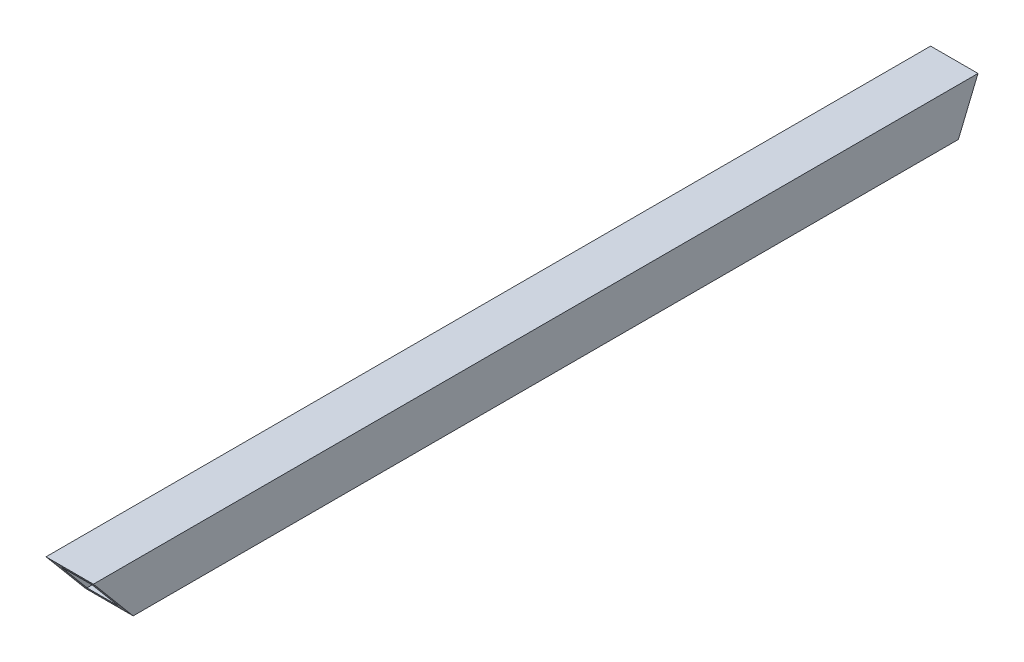
ISO-10303-21;
HEADER;
FILE_DESCRIPTION(('STEP AP214'),'2;1');
FILE_NAME('part.step','',(''),(''),'','','');
FILE_SCHEMA(('AUTOMOTIVE_DESIGN { 1 0 10303 214 1 1 1 1 }'));
ENDSEC;
DATA;
#1=APPLICATION_CONTEXT('core data for automotive mechanical design processes');
#2=APPLICATION_PROTOCOL_DEFINITION('international standard','automotive_design',2000,#1);
#3=PRODUCT_CONTEXT('',#1,'mechanical');
#4=PRODUCT('Part','Part','',(#3));
#5=PRODUCT_RELATED_PRODUCT_CATEGORY('part','',(#4));
#6=PRODUCT_DEFINITION_FORMATION('','',#4);
#7=PRODUCT_DEFINITION_CONTEXT('part definition',#1,'design');
#8=PRODUCT_DEFINITION('design','',#6,#7);
#9=PRODUCT_DEFINITION_SHAPE('','',#8);
#10=(LENGTH_UNIT() NAMED_UNIT(*) SI_UNIT(.MILLI.,.METRE.));
#11=(NAMED_UNIT(*) PLANE_ANGLE_UNIT() SI_UNIT($,.RADIAN.));
#12=(NAMED_UNIT(*) SI_UNIT($,.STERADIAN.) SOLID_ANGLE_UNIT());
#13=UNCERTAINTY_MEASURE_WITH_UNIT(LENGTH_MEASURE(1.E-05),#10,'distance_accuracy_value','');
#14=(GEOMETRIC_REPRESENTATION_CONTEXT(3) GLOBAL_UNCERTAINTY_ASSIGNED_CONTEXT((#13)) GLOBAL_UNIT_ASSIGNED_CONTEXT((#10,
#11,#12)) REPRESENTATION_CONTEXT('',''));
#15=CARTESIAN_POINT('',(0.,0.,0.));
#16=DIRECTION('',(0.,0.,1.));
#17=DIRECTION('',(1.,0.,0.));
#18=AXIS2_PLACEMENT_3D('',#15,#16,#17);
#19=CARTESIAN_POINT('',(9.525,-9.525,177.8));
#20=DIRECTION('',(-1.,0.,0.));
#21=DIRECTION('',(0.,0.,1.));
#22=AXIS2_PLACEMENT_3D('',#19,#20,#21);
#23=PLANE('',#22);
#24=DIRECTION('',(0.,0.,-1.));
#25=VECTOR('',#24,1.);
#26=CARTESIAN_POINT('',(9.525,-9.525,177.8));
#27=LINE('',#26,#25);
#28=CARTESIAN_POINT('',(9.525,-9.525,161.815152026073));
#29=VERTEX_POINT('',#28);
#30=CARTESIAN_POINT('',(9.525,-9.525,-169.909231636793));
#31=VERTEX_POINT('',#30);
#32=EDGE_CURVE('E122',#29,#31,#27,.T.);
#33=ORIENTED_EDGE('',*,*,#32,.T.);
#34=DIRECTION('',(0.,-0.923879532511288,0.382683432365087));
#35=VECTOR('',#34,1.);
#36=CARTESIAN_POINT('',(9.525,9.525,-177.8));
#37=LINE('',#36,#35);
#38=CARTESIAN_POINT('',(9.525,9.525,-177.8));
#39=VERTEX_POINT('',#38);
#40=EDGE_CURVE('E48',#39,#31,#37,.T.);
#41=ORIENTED_EDGE('',*,*,#40,.F.);
#42=DIRECTION('',(0.,0.,-1.));
#43=VECTOR('',#42,1.);
#44=CARTESIAN_POINT('',(9.525,9.525,177.8));
#45=LINE('',#44,#43);
#46=CARTESIAN_POINT('',(9.525,9.525,177.8));
#47=VERTEX_POINT('',#46);
#48=EDGE_CURVE('E112',#47,#39,#45,.T.);
#49=ORIENTED_EDGE('',*,*,#48,.F.);
#50=DIRECTION('',(0.,0.766044443118982,0.642787609686535));
#51=VECTOR('',#50,1.);
#52=CARTESIAN_POINT('',(9.525,9.525,177.8));
#53=LINE('',#52,#51);
#54=EDGE_CURVE('E161',#29,#47,#53,.T.);
#55=ORIENTED_EDGE('',*,*,#54,.F.);
#56=EDGE_LOOP('',(#33,#41,#49,#55));
#57=FACE_BOUND('',#56,.T.);
#58=ADVANCED_FACE('F34',(#57),#23,.F.);
#59=CARTESIAN_POINT('',(-9.525,9.525,177.8));
#60=DIRECTION('',(0.,-1.,0.));
#61=DIRECTION('',(0.,0.,-1.));
#62=AXIS2_PLACEMENT_3D('',#59,#60,#61);
#63=PLANE('',#62);
#64=DIRECTION('',(-1.,0.,0.));
#65=VECTOR('',#64,1.);
#66=CARTESIAN_POINT('',(-9.525,9.525,-177.8));
#67=LINE('',#66,#65);
#68=CARTESIAN_POINT('',(-9.52500000000001,9.525,-177.8));
#69=VERTEX_POINT('',#68);
#70=EDGE_CURVE('E98',#39,#69,#67,.T.);
#71=ORIENTED_EDGE('',*,*,#70,.T.);
#72=DIRECTION('',(0.,0.,-1.));
#73=VECTOR('',#72,1.);
#74=CARTESIAN_POINT('',(-9.525,9.525,177.8));
#75=LINE('',#74,#73);
#76=CARTESIAN_POINT('',(-9.52500000000001,9.525,177.8));
#77=VERTEX_POINT('',#76);
#78=EDGE_CURVE('E110',#77,#69,#75,.T.);
#79=ORIENTED_EDGE('',*,*,#78,.F.);
#80=DIRECTION('',(-1.,0.,0.));
#81=VECTOR('',#80,1.);
#82=CARTESIAN_POINT('',(-9.525,9.525,177.8));
#83=LINE('',#82,#81);
#84=EDGE_CURVE('E113',#47,#77,#83,.T.);
#85=ORIENTED_EDGE('',*,*,#84,.F.);
#86=ORIENTED_EDGE('',*,*,#48,.T.);
#87=EDGE_LOOP('',(#71,#79,#85,#86));
#88=FACE_BOUND('',#87,.T.);
#89=ADVANCED_FACE('F108',(#88),#63,.F.);
#90=CARTESIAN_POINT('',(-9.525,-9.525,177.8));
#91=DIRECTION('',(1.,0.,0.));
#92=DIRECTION('',(0.,1.,0.));
#93=AXIS2_PLACEMENT_3D('',#90,#91,#92);
#94=PLANE('',#93);
#95=ORIENTED_EDGE('',*,*,#78,.T.);
#96=DIRECTION('',(0.,-0.923879532511288,0.382683432365087));
#97=VECTOR('',#96,1.);
#98=CARTESIAN_POINT('',(-9.52500000000001,9.525,-177.8));
#99=LINE('',#98,#97);
#100=CARTESIAN_POINT('',(-9.52500000000001,-9.525,-169.909231636793));
#101=VERTEX_POINT('',#100);
#102=EDGE_CURVE('E95',#69,#101,#99,.T.);
#103=ORIENTED_EDGE('',*,*,#102,.T.);
#104=DIRECTION('',(0.,0.,-1.));
#105=VECTOR('',#104,1.);
#106=CARTESIAN_POINT('',(-9.525,-9.525,177.8));
#107=LINE('',#106,#105);
#108=CARTESIAN_POINT('',(-9.525,-9.525,161.815152026073));
#109=VERTEX_POINT('',#108);
#110=EDGE_CURVE('E119',#109,#101,#107,.T.);
#111=ORIENTED_EDGE('',*,*,#110,.F.);
#112=DIRECTION('',(0.,0.766044443118982,0.642787609686535));
#113=VECTOR('',#112,1.);
#114=CARTESIAN_POINT('',(-9.52500000000001,9.525,177.8));
#115=LINE('',#114,#113);
#116=EDGE_CURVE('E118',#109,#77,#115,.T.);
#117=ORIENTED_EDGE('',*,*,#116,.T.);
#118=EDGE_LOOP('',(#95,#103,#111,#117));
#119=FACE_BOUND('',#118,.T.);
#120=ADVANCED_FACE('F117',(#119),#94,.F.);
#121=CARTESIAN_POINT('',(-9.525,-9.525,177.8));
#122=DIRECTION('',(0.,1.,0.));
#123=DIRECTION('',(0.,0.,1.));
#124=AXIS2_PLACEMENT_3D('',#121,#122,#123);
#125=PLANE('',#124);
#126=ORIENTED_EDGE('',*,*,#110,.T.);
#127=DIRECTION('',(1.,0.,0.));
#128=VECTOR('',#127,1.);
#129=CARTESIAN_POINT('',(-9.52500000000001,-9.525,-169.909231636793));
#130=LINE('',#129,#128);
#131=EDGE_CURVE('E99',#101,#31,#130,.T.);
#132=ORIENTED_EDGE('',*,*,#131,.T.);
#133=ORIENTED_EDGE('',*,*,#32,.F.);
#134=DIRECTION('',(1.,0.,0.));
#135=VECTOR('',#134,1.);
#136=CARTESIAN_POINT('',(-9.52500000000001,-9.525,161.815152026073));
#137=LINE('',#136,#135);
#138=EDGE_CURVE('E146',#109,#29,#137,.T.);
#139=ORIENTED_EDGE('',*,*,#138,.F.);
#140=EDGE_LOOP('',(#126,#132,#133,#139));
#141=FACE_BOUND('',#140,.T.);
#142=ADVANCED_FACE('F164',(#141),#125,.F.);
#143=CARTESIAN_POINT('',(6.34999999999999,-6.34999999999999,177.8));
#144=DIRECTION('',(-1.,0.,0.));
#145=DIRECTION('',(0.,0.,1.));
#146=AXIS2_PLACEMENT_3D('',#143,#144,#145);
#147=PLANE('',#146);
#148=DIRECTION('',(0.,0.923879532511288,-0.382683432365087));
#149=VECTOR('',#148,1.);
#150=CARTESIAN_POINT('',(6.34999999999999,-129.748745770636,-120.110925619301));
#151=LINE('',#150,#149);
#152=CARTESIAN_POINT('',(6.34999999999999,-6.34999999999999,-171.224359697327));
#153=VERTEX_POINT('',#152);
#154=CARTESIAN_POINT('',(6.34999999999999,6.35,-176.484871939465));
#155=VERTEX_POINT('',#154);
#156=EDGE_CURVE('E171',#153,#155,#151,.T.);
#157=ORIENTED_EDGE('',*,*,#156,.F.);
#158=DIRECTION('',(0.,0.,-1.));
#159=VECTOR('',#158,1.);
#160=CARTESIAN_POINT('',(6.34999999999999,-6.34999999999999,177.8));
#161=LINE('',#160,#159);
#162=CARTESIAN_POINT('',(6.34999999999999,-6.34999999999999,164.479293355061));
#163=VERTEX_POINT('',#162);
#164=EDGE_CURVE('E149',#163,#153,#161,.T.);
#165=ORIENTED_EDGE('',*,*,#164,.F.);
#166=DIRECTION('',(0.,-0.766044443118982,-0.642787609686535));
#167=VECTOR('',#166,1.);
#168=CARTESIAN_POINT('',(6.34999999999999,0.209167589768651,169.983088460466));
#169=LINE('',#168,#167);
#170=CARTESIAN_POINT('',(6.34999999999999,6.35,175.135858671012));
#171=VERTEX_POINT('',#170);
#172=EDGE_CURVE('E133',#171,#163,#169,.T.);
#173=ORIENTED_EDGE('',*,*,#172,.F.);
#174=DIRECTION('',(0.,0.,-1.));
#175=VECTOR('',#174,1.);
#176=CARTESIAN_POINT('',(6.34999999999999,6.35,177.8));
#177=LINE('',#176,#175);
#178=EDGE_CURVE('E114',#171,#155,#177,.T.);
#179=ORIENTED_EDGE('',*,*,#178,.T.);
#180=EDGE_LOOP('',(#157,#165,#173,#179));
#181=FACE_BOUND('',#180,.T.);
#182=ADVANCED_FACE('F180',(#181),#147,.T.);
#183=CARTESIAN_POINT('',(-6.35,6.35,177.8));
#184=DIRECTION('',(0.,-1.,0.));
#185=DIRECTION('',(0.,0.,-1.));
#186=AXIS2_PLACEMENT_3D('',#183,#184,#185);
#187=PLANE('',#186);
#188=DIRECTION('',(-1.,0.,0.));
#189=VECTOR('',#188,1.);
#190=CARTESIAN_POINT('',(-6.35,6.35,-176.484871939465));
#191=LINE('',#190,#189);
#192=CARTESIAN_POINT('',(-6.35,6.34999999999999,-176.484871939465));
#193=VERTEX_POINT('',#192);
#194=EDGE_CURVE('E166',#155,#193,#191,.T.);
#195=ORIENTED_EDGE('',*,*,#194,.F.);
#196=ORIENTED_EDGE('',*,*,#178,.F.);
#197=DIRECTION('',(1.,0.,0.));
#198=VECTOR('',#197,1.);
#199=CARTESIAN_POINT('',(-6.35,6.35,175.135858671012));
#200=LINE('',#199,#198);
#201=CARTESIAN_POINT('',(-6.35,6.35,175.135858671012));
#202=VERTEX_POINT('',#201);
#203=EDGE_CURVE('E145',#202,#171,#200,.T.);
#204=ORIENTED_EDGE('',*,*,#203,.F.);
#205=DIRECTION('',(0.,0.,-1.));
#206=VECTOR('',#205,1.);
#207=CARTESIAN_POINT('',(-6.35,6.35,177.8));
#208=LINE('',#207,#206);
#209=EDGE_CURVE('E144',#202,#193,#208,.T.);
#210=ORIENTED_EDGE('',*,*,#209,.T.);
#211=EDGE_LOOP('',(#195,#196,#204,#210));
#212=FACE_BOUND('',#211,.T.);
#213=ADVANCED_FACE('F182',(#212),#187,.T.);
#214=CARTESIAN_POINT('',(-6.35,-6.34999999999999,177.8));
#215=DIRECTION('',(1.,0.,0.));
#216=DIRECTION('',(0.,0.,-1.));
#217=AXIS2_PLACEMENT_3D('',#214,#215,#216);
#218=PLANE('',#217);
#219=DIRECTION('',(0.,-0.923879532511288,0.382683432365087));
#220=VECTOR('',#219,1.);
#221=CARTESIAN_POINT('',(-6.35,-129.748745770636,-120.110925619301));
#222=LINE('',#221,#220);
#223=CARTESIAN_POINT('',(-6.35,-6.34999999999999,-171.224359697327));
#224=VERTEX_POINT('',#223);
#225=EDGE_CURVE('E55',#193,#224,#222,.T.);
#226=ORIENTED_EDGE('',*,*,#225,.F.);
#227=ORIENTED_EDGE('',*,*,#209,.F.);
#228=DIRECTION('',(0.,0.766044443118982,0.642787609686535));
#229=VECTOR('',#228,1.);
#230=CARTESIAN_POINT('',(-6.35,0.209167589768651,169.983088460466));
#231=LINE('',#230,#229);
#232=CARTESIAN_POINT('',(-6.35,-6.34999999999999,164.479293355061));
#233=VERTEX_POINT('',#232);
#234=EDGE_CURVE('E130',#233,#202,#231,.T.);
#235=ORIENTED_EDGE('',*,*,#234,.F.);
#236=DIRECTION('',(0.,0.,-1.));
#237=VECTOR('',#236,1.);
#238=CARTESIAN_POINT('',(-6.35,-6.34999999999999,177.8));
#239=LINE('',#238,#237);
#240=EDGE_CURVE('E142',#233,#224,#239,.T.);
#241=ORIENTED_EDGE('',*,*,#240,.T.);
#242=EDGE_LOOP('',(#226,#227,#235,#241));
#243=FACE_BOUND('',#242,.T.);
#244=ADVANCED_FACE('F141',(#243),#218,.T.);
#245=CARTESIAN_POINT('',(-6.35,-6.34999999999999,177.8));
#246=DIRECTION('',(0.,1.,0.));
#247=DIRECTION('',(0.,0.,1.));
#248=AXIS2_PLACEMENT_3D('',#245,#246,#247);
#249=PLANE('',#248);
#250=DIRECTION('',(1.,0.,0.));
#251=VECTOR('',#250,1.);
#252=CARTESIAN_POINT('',(-6.35,-6.34999999999999,-171.224359697327));
#253=LINE('',#252,#251);
#254=EDGE_CURVE('E11',#224,#153,#253,.T.);
#255=ORIENTED_EDGE('',*,*,#254,.F.);
#256=ORIENTED_EDGE('',*,*,#240,.F.);
#257=DIRECTION('',(-1.,0.,0.));
#258=VECTOR('',#257,1.);
#259=CARTESIAN_POINT('',(-6.35,-6.34999999999999,164.479293355061));
#260=LINE('',#259,#258);
#261=EDGE_CURVE('E41',#163,#233,#260,.T.);
#262=ORIENTED_EDGE('',*,*,#261,.F.);
#263=ORIENTED_EDGE('',*,*,#164,.T.);
#264=EDGE_LOOP('',(#255,#256,#262,#263));
#265=FACE_BOUND('',#264,.T.);
#266=ADVANCED_FACE('F148',(#265),#249,.T.);
#267=CARTESIAN_POINT('',(-9.52500000000001,9.525,177.8));
#268=DIRECTION('',(0.,0.642787609686535,-0.766044443118982));
#269=DIRECTION('',(0.,0.766044443118982,0.642787609686535));
#270=AXIS2_PLACEMENT_3D('',#267,#268,#269);
#271=PLANE('',#270);
#272=ORIENTED_EDGE('',*,*,#172,.T.);
#273=ORIENTED_EDGE('',*,*,#261,.T.);
#274=ORIENTED_EDGE('',*,*,#234,.T.);
#275=ORIENTED_EDGE('',*,*,#203,.T.);
#276=EDGE_LOOP('',(#272,#273,#274,#275));
#277=FACE_BOUND('',#276,.T.);
#278=ORIENTED_EDGE('',*,*,#54,.T.);
#279=ORIENTED_EDGE('',*,*,#84,.T.);
#280=ORIENTED_EDGE('',*,*,#116,.F.);
#281=ORIENTED_EDGE('',*,*,#138,.T.);
#282=EDGE_LOOP('',(#278,#279,#280,#281));
#283=FACE_BOUND('',#282,.T.);
#284=ADVANCED_FACE('F128',(#277,#283),#271,.F.);
#285=CARTESIAN_POINT('',(-9.52500000000001,9.525,-177.8));
#286=DIRECTION('',(0.,0.382683432365087,0.923879532511288));
#287=DIRECTION('',(0.,-0.923879532511288,0.382683432365087));
#288=AXIS2_PLACEMENT_3D('',#285,#286,#287);
#289=PLANE('',#288);
#290=ORIENTED_EDGE('',*,*,#156,.T.);
#291=ORIENTED_EDGE('',*,*,#194,.T.);
#292=ORIENTED_EDGE('',*,*,#225,.T.);
#293=ORIENTED_EDGE('',*,*,#254,.T.);
#294=EDGE_LOOP('',(#290,#291,#292,#293));
#295=FACE_BOUND('',#294,.T.);
#296=ORIENTED_EDGE('',*,*,#40,.T.);
#297=ORIENTED_EDGE('',*,*,#131,.F.);
#298=ORIENTED_EDGE('',*,*,#102,.F.);
#299=ORIENTED_EDGE('',*,*,#70,.F.);
#300=EDGE_LOOP('',(#296,#297,#298,#299));
#301=FACE_BOUND('',#300,.T.);
#302=ADVANCED_FACE('F97',(#295,#301),#289,.F.);
#303=CLOSED_SHELL('',(#58,#89,#120,#142,#182,#213,#244,#266,#284,#302));
#304=MANIFOLD_SOLID_BREP('B2',#303);
#305=ADVANCED_BREP_SHAPE_REPRESENTATION('',(#18,#304),#14);
#306=SHAPE_DEFINITION_REPRESENTATION(#9,#305);
ENDSEC;
END-ISO-10303-21;
